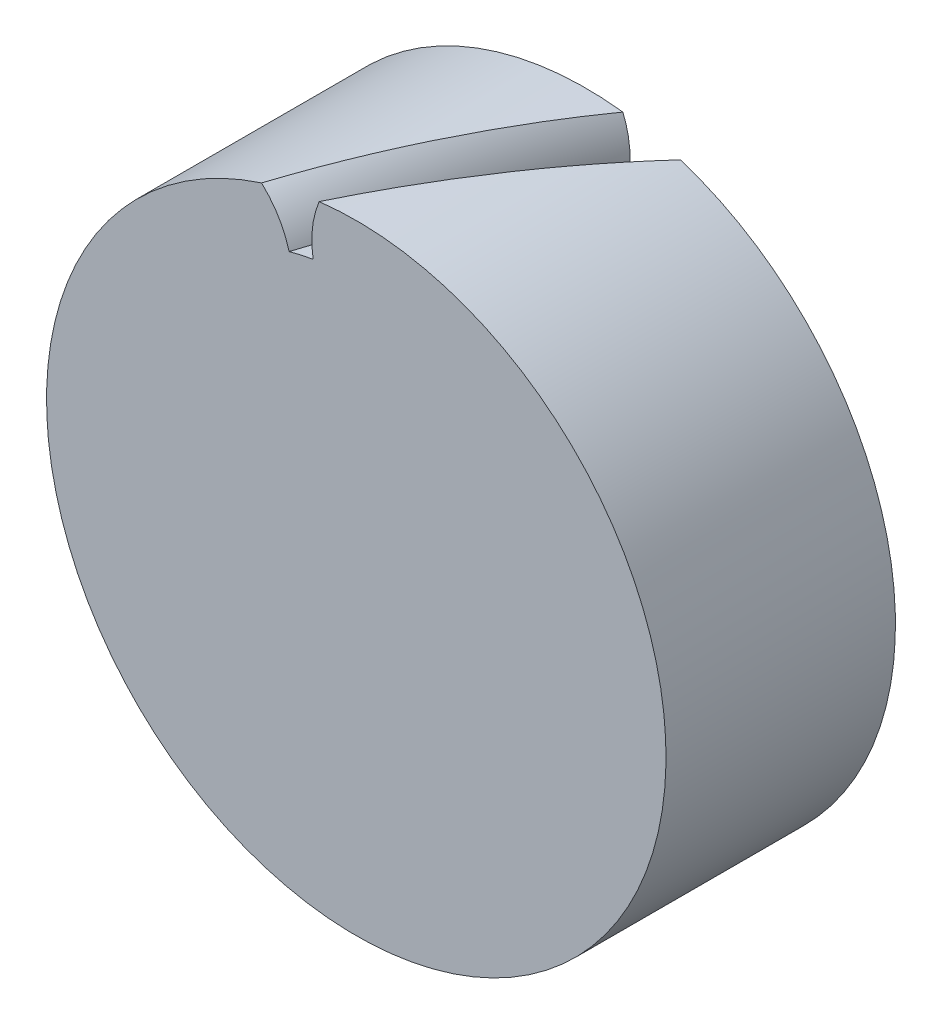
ISO-10303-21;
HEADER;
FILE_DESCRIPTION(('STEP AP214'),'2;1');
FILE_NAME('part.step','',(''),(''),'','','');
FILE_SCHEMA(('AUTOMOTIVE_DESIGN { 1 0 10303 214 1 1 1 1 }'));
ENDSEC;
DATA;
#1=APPLICATION_CONTEXT('core data for automotive mechanical design processes');
#2=APPLICATION_PROTOCOL_DEFINITION('international standard','automotive_design',2000,#1);
#3=PRODUCT_CONTEXT('',#1,'mechanical');
#4=PRODUCT('Part','Part','',(#3));
#5=PRODUCT_RELATED_PRODUCT_CATEGORY('part','',(#4));
#6=PRODUCT_DEFINITION_FORMATION('','',#4);
#7=PRODUCT_DEFINITION_CONTEXT('part definition',#1,'design');
#8=PRODUCT_DEFINITION('design','',#6,#7);
#9=PRODUCT_DEFINITION_SHAPE('','',#8);
#10=(LENGTH_UNIT() NAMED_UNIT(*) SI_UNIT(.MILLI.,.METRE.));
#11=(NAMED_UNIT(*) PLANE_ANGLE_UNIT() SI_UNIT($,.RADIAN.));
#12=(NAMED_UNIT(*) SI_UNIT($,.STERADIAN.) SOLID_ANGLE_UNIT());
#13=UNCERTAINTY_MEASURE_WITH_UNIT(LENGTH_MEASURE(1.E-05),#10,'distance_accuracy_value','');
#14=(GEOMETRIC_REPRESENTATION_CONTEXT(3) GLOBAL_UNCERTAINTY_ASSIGNED_CONTEXT((#13)) GLOBAL_UNIT_ASSIGNED_CONTEXT((#10,
#11,#12)) REPRESENTATION_CONTEXT('',''));
#15=CARTESIAN_POINT('',(0.,0.,0.));
#16=DIRECTION('',(0.,0.,1.));
#17=DIRECTION('',(1.,0.,0.));
#18=AXIS2_PLACEMENT_3D('',#15,#16,#17);
#19=CARTESIAN_POINT('',(0.,0.,10.));
#20=DIRECTION('',(0.,0.,-1.));
#21=DIRECTION('',(-1.,0.,0.));
#22=AXIS2_PLACEMENT_3D('',#19,#20,#21);
#23=CYLINDRICAL_SURFACE('',#22,27.);
#24=CARTESIAN_POINT('',(0.,0.,10.));
#25=DIRECTION('',(0.,0.,1.));
#26=DIRECTION('',(1.,0.,0.));
#27=AXIS2_PLACEMENT_3D('',#24,#25,#26);
#28=CIRCLE('',#27,27.);
#29=CARTESIAN_POINT('',(-8.25696296941396,25.7064672254916,10.));
#30=VERTEX_POINT('',#29);
#31=CARTESIAN_POINT('',(-3.23765342477109,26.8051779240424,10.));
#32=VERTEX_POINT('',#31);
#33=EDGE_CURVE('E214',#30,#32,#28,.T.);
#34=ORIENTED_EDGE('',*,*,#33,.F.);
#35=CARTESIAN_POINT('',(-8.25696026557784,25.7064701422165,10.));
#36=CARTESIAN_POINT('',(-7.75609582312508,25.867311022671,9.11018409200946));
#37=CARTESIAN_POINT('',(-7.25289550092229,26.0128288893422,8.21894372586695));
#38=CARTESIAN_POINT('',(-6.24245378029868,26.2736468737349,6.43439707192594));
#39=CARTESIAN_POINT('',(-5.7352126047221,26.3889486460831,5.54109089995413));
#40=CARTESIAN_POINT('',(-4.71727983027751,26.5897772908865,3.75312428580812));
#41=CARTESIAN_POINT('',(-4.2065883333167,26.6753050388491,2.85846388423223));
#42=CARTESIAN_POINT('',(-3.4384070470463,26.7814146140112,1.51595952401838));
#43=CARTESIAN_POINT('',(-3.18198087286649,26.8130881364102,1.0683578252626));
#44=CARTESIAN_POINT('',(-2.66850350092856,26.8690488608898,0.173039829480591));
#45=CARTESIAN_POINT('',(-2.41145229243359,26.8933359351693,-0.274676469394325));
#46=CARTESIAN_POINT('',(-1.70866889315477,26.9495860904168,-1.4972938733394));
#47=CARTESIAN_POINT('',(-1.26232824542937,26.9741883358157,-2.27219632091321));
#48=CARTESIAN_POINT('',(-0.367666766123542,27.0012052829509,-3.82126078119767));
#49=CARTESIAN_POINT('',(0.0806541176172088,27.0036193967126,-4.59542277374305));
#50=CARTESIAN_POINT('',(0.97939301768367,26.985974971841,-6.14254084611833));
#51=CARTESIAN_POINT('',(1.42981151298851,26.9659110218283,-6.91549659068727));
#52=CARTESIAN_POINT('',(2.1067939535436,26.9186287505762,-8.07340807952899));
#53=CARTESIAN_POINT('',(2.33268161207749,26.900003474859,-8.45912669239636));
#54=CARTESIAN_POINT('',(2.78486914889492,26.8569558347006,-9.23000048138497));
#55=CARTESIAN_POINT('',(3.01116902897621,26.832533444917,-9.61515565503569));
#56=CARTESIAN_POINT('',(3.23765470740453,26.8051784548362,-10.));
#57=B_SPLINE_CURVE_WITH_KNOTS('',3,(#35,#36,#37,#38,#39,#40,#41,#42,#43,#44,#45,#46,#47,#48,#49,
#50,#51,#52,#53,#54,#55,#56),.UNSPECIFIED.,.F.,.F.,(4,2,2,2,2,2,2,2,2,2,4),(0.,3.10089920016716,
6.20162856029111,9.30226673553687,10.8526870443948,12.4031341772638,15.0866200171567,
17.7701769679072,20.4543800982374,21.7964942464809,23.1386142619668),.UNSPECIFIED.);
#58=CARTESIAN_POINT('',(3.23765342477108,26.8051779240424,-10.));
#59=VERTEX_POINT('',#58);
#60=EDGE_CURVE('E136',#30,#59,#57,.T.);
#61=ORIENTED_EDGE('',*,*,#60,.T.);
#62=CARTESIAN_POINT('',(0.,0.,-10.));
#63=DIRECTION('',(0.,0.,1.));
#64=DIRECTION('',(1.,0.,0.));
#65=AXIS2_PLACEMENT_3D('',#62,#63,#64);
#66=CIRCLE('',#65,27.);
#67=CARTESIAN_POINT('',(8.256962969414,25.7064672254915,-10.));
#68=VERTEX_POINT('',#67);
#69=EDGE_CURVE('E169',#59,#68,#66,.T.);
#70=ORIENTED_EDGE('',*,*,#69,.T.);
#71=CARTESIAN_POINT('',(8.25696026557721,25.7064701422164,-10.));
#72=CARTESIAN_POINT('',(7.75609582312477,25.867311022671,-9.1101840920093));
#73=CARTESIAN_POINT('',(7.2528955009221,26.0128288893422,-8.21894372586672));
#74=CARTESIAN_POINT('',(6.24245378029859,26.273646873735,-6.43439707192567));
#75=CARTESIAN_POINT('',(5.73521260472197,26.3889486460831,-5.54109089995389));
#76=CARTESIAN_POINT('',(4.71727983027736,26.5897772908866,-3.75312428580789));
#77=CARTESIAN_POINT('',(4.20658833331656,26.6753050388492,-2.858463884232));
#78=CARTESIAN_POINT('',(3.43840704704616,26.7814146140113,-1.51595952401815));
#79=CARTESIAN_POINT('',(3.18198087286635,26.8130881364102,-1.06835782526236));
#80=CARTESIAN_POINT('',(2.66850350092842,26.8690488608898,-0.173039829480356));
#81=CARTESIAN_POINT('',(2.41145229243345,26.8933359351693,0.274676469394561));
#82=CARTESIAN_POINT('',(1.70866889315465,26.9495860904168,1.49729387333962));
#83=CARTESIAN_POINT('',(1.26232824542926,26.9741883358157,2.27219632091342));
#84=CARTESIAN_POINT('',(0.367666766123453,27.0012052829509,3.82126078119783));
#85=CARTESIAN_POINT('',(-0.0806541176172951,27.0036193967126,4.59542277374319));
#86=CARTESIAN_POINT('',(-0.979393017683737,26.985974971841,6.14254084611844));
#87=CARTESIAN_POINT('',(-1.42981151298856,26.9659110218283,6.91549659068736));
#88=CARTESIAN_POINT('',(-2.10679395354363,26.9186287505762,8.07340807952905));
#89=CARTESIAN_POINT('',(-2.33268161207752,26.900003474859,8.45912669239641));
#90=CARTESIAN_POINT('',(-2.78486914889493,26.8569558347006,9.23000048138499));
#91=CARTESIAN_POINT('',(-3.01116902897622,26.832533444917,9.61515565503571));
#92=CARTESIAN_POINT('',(-3.23765470740453,26.8051784548362,10.));
#93=B_SPLINE_CURVE_WITH_KNOTS('',3,(#71,#72,#73,#74,#75,#76,#77,#78,#79,#80,#81,#82,#83,#84,#85,
#86,#87,#88,#89,#90,#91,#92),.UNSPECIFIED.,.F.,.F.,(4,2,2,2,2,2,2,2,2,2,4),(0.,3.10089920016716,
6.2016285602911,9.30226673553685,10.8526870443948,12.4031341772638,15.0866200171566,
17.7701769679071,20.4543800982372,21.7964942464807,23.1386142619665),.UNSPECIFIED.);
#94=EDGE_CURVE('E216',#68,#32,#93,.T.);
#95=ORIENTED_EDGE('',*,*,#94,.T.);
#96=EDGE_LOOP('',(#34,#61,#70,#95));
#97=FACE_BOUND('',#96,.T.);
#98=ADVANCED_FACE('F111',(#97),#23,.T.);
#99=CARTESIAN_POINT('',(0.,0.,10.));
#100=DIRECTION('',(0.,0.,1.));
#101=DIRECTION('',(1.,0.,0.));
#102=AXIS2_PLACEMENT_3D('',#99,#100,#101);
#103=PLANE('',#102);
#104=CARTESIAN_POINT('',(-13.9752183891057,19.5371865467204,10.));
#105=DIRECTION('',(0.,0.,-1.));
#106=DIRECTION('',(-1.,0.,0.));
#107=AXIS2_PLACEMENT_3D('',#104,#105,#106);
#108=CIRCLE('',#107,8.4118004722266);
#109=CARTESIAN_POINT('',(-5.85301495879601,21.7253818353582,10.));
#110=VERTEX_POINT('',#109);
#111=EDGE_CURVE('E115',#30,#110,#108,.T.);
#112=ORIENTED_EDGE('',*,*,#111,.F.);
#113=ORIENTED_EDGE('',*,*,#33,.T.);
#114=CARTESIAN_POINT('',(4.53504410805324,23.5890178286965,10.));
#115=DIRECTION('',(0.,0.,1.));
#116=DIRECTION('',(1.,0.,0.));
#117=AXIS2_PLACEMENT_3D('',#114,#115,#116);
#118=CIRCLE('',#117,8.4118004722266);
#119=CARTESIAN_POINT('',(-3.7585613536276,22.1838503545038,10.));
#120=VERTEX_POINT('',#119);
#121=EDGE_CURVE('E270',#32,#120,#118,.T.);
#122=ORIENTED_EDGE('',*,*,#121,.T.);
#123=CARTESIAN_POINT('',(0.,0.,10.));
#124=DIRECTION('',(0.,0.,1.));
#125=DIRECTION('',(1.,0.,0.));
#126=AXIS2_PLACEMENT_3D('',#123,#124,#125);
#127=CIRCLE('',#126,22.5);
#128=EDGE_CURVE('E215',#120,#110,#127,.T.);
#129=ORIENTED_EDGE('',*,*,#128,.T.);
#130=EDGE_LOOP('',(#112,#113,#122,#129));
#131=FACE_BOUND('',#130,.T.);
#132=ADVANCED_FACE('F188',(#131),#103,.T.);
#133=CARTESIAN_POINT('',(0.,0.,-10.));
#134=DIRECTION('',(0.,0.,1.));
#135=DIRECTION('',(1.,0.,0.));
#136=AXIS2_PLACEMENT_3D('',#133,#134,#135);
#137=PLANE('',#136);
#138=ORIENTED_EDGE('',*,*,#69,.F.);
#139=CARTESIAN_POINT('',(3.7585613536276,22.1838503545038,-10.));
#140=CARTESIAN_POINT('',(4.0905881360469,24.1435449721713,-10.));
#141=CARTESIAN_POINT('',(3.71787160579446,26.1577556867576,-10.));
#142=CARTESIAN_POINT('',(2.70658399869858,27.8688787549479,-10.));
#143=B_SPLINE_CURVE_WITH_KNOTS('',3,(#139,#140,#141,#142),.UNSPECIFIED.,.F.,.F.,(4,4),(0.,1.),.UNSPECIFIED.);
#144=CARTESIAN_POINT('',(3.75856135362759,22.1838503545038,-10.));
#145=VERTEX_POINT('',#144);
#146=EDGE_CURVE('E12',#59,#145,#143,.F.);
#147=ORIENTED_EDGE('',*,*,#146,.T.);
#148=CARTESIAN_POINT('',(0.,0.,-10.));
#149=DIRECTION('',(0.,0.,1.));
#150=DIRECTION('',(1.,0.,0.));
#151=AXIS2_PLACEMENT_3D('',#148,#149,#150);
#152=CIRCLE('',#151,22.5);
#153=CARTESIAN_POINT('',(5.85301495879601,21.7253818353582,-10.));
#154=VERTEX_POINT('',#153);
#155=EDGE_CURVE('E153',#154,#145,#152,.T.);
#156=ORIENTED_EDGE('',*,*,#155,.F.);
#157=CARTESIAN_POINT('',(9.18385221913443,26.4510275493619,-10.));
#158=CARTESIAN_POINT('',(7.55018190977544,25.3188764556126,-10.));
#159=CARTESIAN_POINT('',(6.37006324971867,23.6445758963152,-10.));
#160=CARTESIAN_POINT('',(5.85301495879601,21.7253818353582,-10.));
#161=B_SPLINE_CURVE_WITH_KNOTS('',3,(#157,#158,#159,#160),.UNSPECIFIED.,.F.,.F.,(4,4),(0.,1.),.UNSPECIFIED.);
#162=EDGE_CURVE('E121',#154,#68,#161,.F.);
#163=ORIENTED_EDGE('',*,*,#162,.T.);
#164=EDGE_LOOP('',(#138,#147,#156,#163));
#165=FACE_BOUND('',#164,.T.);
#166=ADVANCED_FACE('F167',(#165),#137,.F.);
#167=CARTESIAN_POINT('',(2.70658399869858,27.8688787549479,-10.));
#168=CARTESIAN_POINT('',(0.673722742788556,28.0612904740134,-6.66666666666667));
#169=CARTESIAN_POINT('',(-3.34087788276031,28.0173936588146,0.));
#170=CARTESIAN_POINT('',(-7.25323473576679,27.116056336956,6.66666666666667));
#171=CARTESIAN_POINT('',(-9.18385221913444,26.4510275493618,10.));
#172=CARTESIAN_POINT('',(3.71787160579446,26.1577556867576,-10.));
#173=CARTESIAN_POINT('',(1.82314414331141,26.3760776703804,-6.66666666666667));
#174=CARTESIAN_POINT('',(-1.96730334143237,26.5558236657689,0.));
#175=CARTESIAN_POINT('',(-5.73463728913742,25.9032174314929,6.66666666666667));
#176=CARTESIAN_POINT('',(-7.55018190977544,25.3188764556125,10.));
#177=CARTESIAN_POINT('',(4.0905881360469,24.1435449721713,-10.));
#178=CARTESIAN_POINT('',(2.33399446699083,24.3877772203515,-6.66666666666667));
#179=CARTESIAN_POINT('',(-1.16564892271917,24.6516219966958,0.));
#180=CARTESIAN_POINT('',(-4.66959149181028,24.1482290604817,6.66666666666667));
#181=CARTESIAN_POINT('',(-6.37006324971867,23.6445758963152,10.));
#182=CARTESIAN_POINT('',(3.7585613536276,22.1838503545038,-10.));
#183=CARTESIAN_POINT('',(2.1401014779985,22.4539928672413,-6.66666666666667));
#184=CARTESIAN_POINT('',(-1.08028778303454,22.6477239601212,0.));
#185=CARTESIAN_POINT('',(-4.26761606361725,22.1483471878109,6.66666666666667));
#186=CARTESIAN_POINT('',(-5.85301495879601,21.7253818353582,10.));
#187=B_SPLINE_SURFACE_WITH_KNOTS('',3,3,((#167,#168,#169,#170,#171),(#172,#173,#174,#175,#176),
(#177,#178,#179,#180,#181),(#182,#183,#184,#185,#186)),.UNSPECIFIED.,.F.,.F.,.F.,(4,4),(4,1,4),
(0.,1.),(0.,0.5,1.),.UNSPECIFIED.);
#188=CARTESIAN_POINT('',(3.7585613536276,22.1838503545038,-10.));
#189=CARTESIAN_POINT('',(2.1401014779985,22.4539928672413,-6.66666666666667));
#190=CARTESIAN_POINT('',(-1.08028778303454,22.6477239601212,0.));
#191=CARTESIAN_POINT('',(-4.26761606361725,22.1483471878109,6.66666666666667));
#192=CARTESIAN_POINT('',(-5.85301495879601,21.7253818353582,10.));
#193=B_SPLINE_CURVE_WITH_KNOTS('',3,(#188,#189,#190,#191,#192),.UNSPECIFIED.,.F.,.F.,(4,1,4),
(0.,0.5,1.),.UNSPECIFIED.);
#194=EDGE_CURVE('E156',#145,#110,#193,.T.);
#195=ORIENTED_EDGE('',*,*,#111,.T.);
#196=ORIENTED_EDGE('',*,*,#194,.F.);
#197=ORIENTED_EDGE('',*,*,#146,.F.);
#198=ORIENTED_EDGE('',*,*,#60,.F.);
#199=EDGE_LOOP('',(#195,#196,#197,#198));
#200=FACE_BOUND('',#199,.T.);
#201=ADVANCED_FACE('F161',(#200),#187,.F.);
#202=CARTESIAN_POINT('',(5.85301495879601,21.7253818353582,-10.));
#203=CARTESIAN_POINT('',(4.26761606361724,22.1483471878109,-6.66666666666667));
#204=CARTESIAN_POINT('',(1.08028778303454,22.6477239601212,0.));
#205=CARTESIAN_POINT('',(-2.1401014779985,22.4539928672413,6.66666666666667));
#206=CARTESIAN_POINT('',(-3.7585613536276,22.1838503545038,10.));
#207=CARTESIAN_POINT('',(6.37006324971867,23.6445758963152,-10.));
#208=CARTESIAN_POINT('',(4.66959149181027,24.1482290604817,-6.66666666666667));
#209=CARTESIAN_POINT('',(1.16564892271916,24.6516219966958,0.));
#210=CARTESIAN_POINT('',(-2.33399446699083,24.3877772203515,6.66666666666667));
#211=CARTESIAN_POINT('',(-4.09058813604691,24.1435449721713,10.));
#212=CARTESIAN_POINT('',(7.55018190977544,25.3188764556126,-10.));
#213=CARTESIAN_POINT('',(5.73463728913742,25.9032174314929,-6.66666666666667));
#214=CARTESIAN_POINT('',(1.96730334143237,26.5558236657689,0.));
#215=CARTESIAN_POINT('',(-1.82314414331141,26.3760776703804,6.66666666666667));
#216=CARTESIAN_POINT('',(-3.71787160579446,26.1577556867576,10.));
#217=CARTESIAN_POINT('',(9.18385221913443,26.4510275493619,-10.));
#218=CARTESIAN_POINT('',(7.25323473576679,27.116056336956,-6.66666666666667));
#219=CARTESIAN_POINT('',(3.3408778827603,28.0173936588146,0.));
#220=CARTESIAN_POINT('',(-0.67372274278856,28.0612904740134,6.66666666666667));
#221=CARTESIAN_POINT('',(-2.70658399869859,27.8688787549479,10.));
#222=B_SPLINE_SURFACE_WITH_KNOTS('',3,3,((#202,#203,#204,#205,#206),(#207,#208,#209,#210,#211),
(#212,#213,#214,#215,#216),(#217,#218,#219,#220,#221)),.UNSPECIFIED.,.F.,.F.,.F.,(4,4),(4,1,4),
(0.,1.),(0.,0.5,1.),.UNSPECIFIED.);
#223=CARTESIAN_POINT('',(5.85301495879601,21.7253818353582,-10.));
#224=CARTESIAN_POINT('',(4.26761606361725,22.1483471878109,-6.66666666666666));
#225=CARTESIAN_POINT('',(1.08028778303454,22.6477239601212,0.));
#226=CARTESIAN_POINT('',(-2.1401014779985,22.4539928672413,6.66666666666667));
#227=CARTESIAN_POINT('',(-3.7585613536276,22.1838503545038,10.));
#228=B_SPLINE_CURVE_WITH_KNOTS('',3,(#223,#224,#225,#226,#227),.UNSPECIFIED.,.F.,.F.,(4,1,4),
(0.,0.5,1.),.UNSPECIFIED.);
#229=EDGE_CURVE('E128',#154,#120,#228,.T.);
#230=ORIENTED_EDGE('',*,*,#162,.F.);
#231=ORIENTED_EDGE('',*,*,#229,.T.);
#232=ORIENTED_EDGE('',*,*,#121,.F.);
#233=ORIENTED_EDGE('',*,*,#94,.F.);
#234=EDGE_LOOP('',(#230,#231,#232,#233));
#235=FACE_BOUND('',#234,.T.);
#236=ADVANCED_FACE('F226',(#235),#222,.F.);
#237=CARTESIAN_POINT('',(3.75856135362759,22.1838503545038,-10.));
#238=CARTESIAN_POINT('',(2.14010147799849,22.4539928672413,-6.66666666666666));
#239=CARTESIAN_POINT('',(-1.08028778303454,22.6477239601212,0.));
#240=CARTESIAN_POINT('',(-4.26761606361725,22.1483471878109,6.66666666666667));
#241=CARTESIAN_POINT('',(-5.85301495879602,21.7253818353582,10.));
#242=CARTESIAN_POINT('',(3.93478797939871,22.1539926618797,-10.));
#243=CARTESIAN_POINT('',(2.31856165892155,22.4369775558878,-6.66666666666666));
#244=CARTESIAN_POINT('',(-0.900377097491241,22.6563244207834,0.));
#245=CARTESIAN_POINT('',(-4.09175721231511,22.1822258023256,6.66666666666666));
#246=CARTESIAN_POINT('',(-5.6804303680576,21.771877689788,10.));
#247=CARTESIAN_POINT('',(4.28652963900203,22.0900773098422,-10.));
#248=CARTESIAN_POINT('',(2.67477042882872,22.3987469663914,-6.66666666666667));
#249=CARTESIAN_POINT('',(-0.540348071555246,22.6691719406245,0.));
#250=CARTESIAN_POINT('',(-3.73893138585906,22.2458698640052,6.66666666666665));
#251=CARTESIAN_POINT('',(-5.334153062729,21.8607562312979,9.99999999999999));
#252=CARTESIAN_POINT('',(4.81170769204014,21.9816587219355,-10.));
#253=CARTESIAN_POINT('',(3.20782679130998,22.3286348362553,-6.66666666666667));
#254=CARTESIAN_POINT('',(0.,22.6756250101761,0.));
#255=CARTESIAN_POINT('',(-3.20782679130998,22.3286348362553,6.66666666666668));
#256=CARTESIAN_POINT('',(-4.81170769204013,21.9816587219355,10.));
#257=CARTESIAN_POINT('',(5.33415306272897,21.8607562312979,-10.));
#258=CARTESIAN_POINT('',(3.73893138585906,22.2458698640052,-6.66666666666666));
#259=CARTESIAN_POINT('',(0.540348071555248,22.6691719406246,0.));
#260=CARTESIAN_POINT('',(-2.67477042882873,22.3987469663914,6.66666666666667));
#261=CARTESIAN_POINT('',(-4.28652963900204,22.0900773098422,9.99999999999999));
#262=CARTESIAN_POINT('',(5.68043036805759,21.771877689788,-10.));
#263=CARTESIAN_POINT('',(4.09175721231512,22.1822258023256,-6.66666666666666));
#264=CARTESIAN_POINT('',(0.900377097491236,22.6563244207834,0.));
#265=CARTESIAN_POINT('',(-2.31856165892154,22.4369775558878,6.66666666666666));
#266=CARTESIAN_POINT('',(-3.93478797939872,22.1539926618797,10.));
#267=CARTESIAN_POINT('',(5.85301495879601,21.7253818353582,-10.));
#268=CARTESIAN_POINT('',(4.26761606361725,22.1483471878109,-6.66666666666666));
#269=CARTESIAN_POINT('',(1.08028778303454,22.6477239601212,0.));
#270=CARTESIAN_POINT('',(-2.1401014779985,22.4539928672413,6.66666666666667));
#271=CARTESIAN_POINT('',(-3.7585613536276,22.1838503545038,10.));
#272=B_SPLINE_SURFACE_WITH_KNOTS('',3,3,((#237,#238,#239,#240,#241),(#242,#243,#244,#245,#246),
(#247,#248,#249,#250,#251),(#252,#253,#254,#255,#256),(#257,#258,#259,#260,#261),(#262,#263,
#264,#265,#266),(#267,#268,#269,#270,#271)),.UNSPECIFIED.,.F.,.F.,.F.,(4,1,1,1,4),(4,1,4),(0.,
0.25,0.5,0.75,1.),(0.,0.5,1.),.UNSPECIFIED.);
#273=ORIENTED_EDGE('',*,*,#155,.T.);
#274=ORIENTED_EDGE('',*,*,#194,.T.);
#275=ORIENTED_EDGE('',*,*,#128,.F.);
#276=ORIENTED_EDGE('',*,*,#229,.F.);
#277=EDGE_LOOP('',(#273,#274,#275,#276));
#278=FACE_BOUND('',#277,.T.);
#279=ADVANCED_FACE('F155',(#278),#272,.F.);
#280=CLOSED_SHELL('',(#98,#132,#166,#201,#236,#279));
#281=MANIFOLD_SOLID_BREP('B2',#280);
#282=ADVANCED_BREP_SHAPE_REPRESENTATION('',(#18,#281),#14);
#283=SHAPE_DEFINITION_REPRESENTATION(#9,#282);
ENDSEC;
END-ISO-10303-21;
